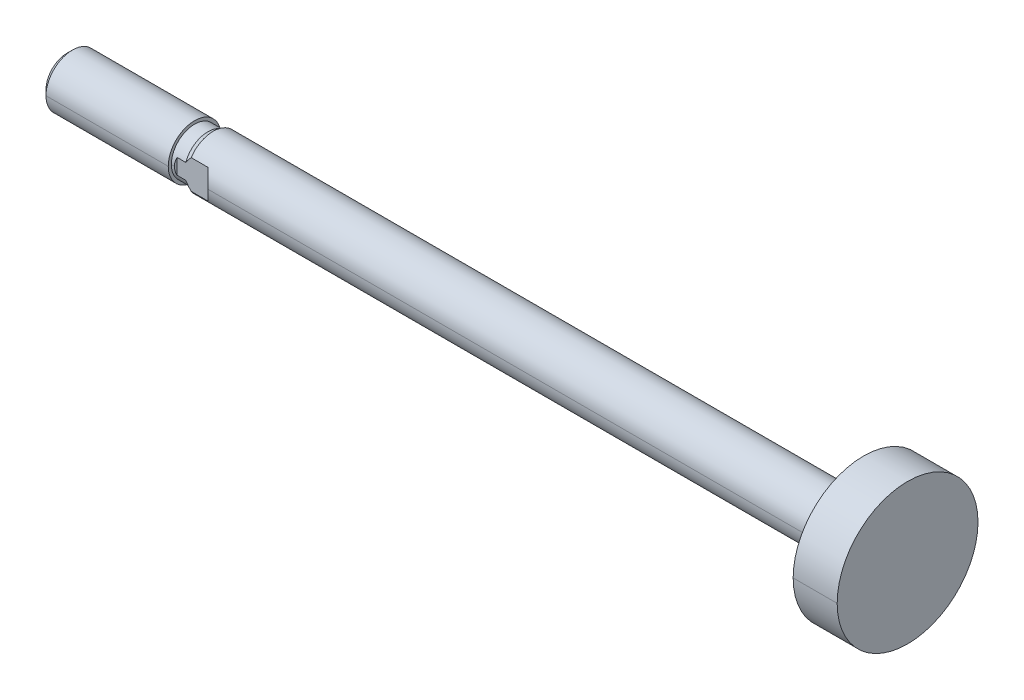
ISO-10303-21;
HEADER;
FILE_DESCRIPTION(('STEP AP214'),'2;1');
FILE_NAME('part.step','',(''),(''),'','','');
FILE_SCHEMA(('AUTOMOTIVE_DESIGN { 1 0 10303 214 1 1 1 1 }'));
ENDSEC;
DATA;
#1=APPLICATION_CONTEXT('core data for automotive mechanical design processes');
#2=APPLICATION_PROTOCOL_DEFINITION('international standard','automotive_design',2000,#1);
#3=PRODUCT_CONTEXT('',#1,'mechanical');
#4=PRODUCT('Part','Part','',(#3));
#5=PRODUCT_RELATED_PRODUCT_CATEGORY('part','',(#4));
#6=PRODUCT_DEFINITION_FORMATION('','',#4);
#7=PRODUCT_DEFINITION_CONTEXT('part definition',#1,'design');
#8=PRODUCT_DEFINITION('design','',#6,#7);
#9=PRODUCT_DEFINITION_SHAPE('','',#8);
#10=(LENGTH_UNIT() NAMED_UNIT(*) SI_UNIT(.MILLI.,.METRE.));
#11=(NAMED_UNIT(*) PLANE_ANGLE_UNIT() SI_UNIT($,.RADIAN.));
#12=(NAMED_UNIT(*) SI_UNIT($,.STERADIAN.) SOLID_ANGLE_UNIT());
#13=UNCERTAINTY_MEASURE_WITH_UNIT(LENGTH_MEASURE(1.E-05),#10,'distance_accuracy_value','');
#14=(GEOMETRIC_REPRESENTATION_CONTEXT(3) GLOBAL_UNCERTAINTY_ASSIGNED_CONTEXT((#13)) GLOBAL_UNIT_ASSIGNED_CONTEXT((#10,
#11,#12)) REPRESENTATION_CONTEXT('',''));
#15=CARTESIAN_POINT('',(0.,0.,0.));
#16=DIRECTION('',(0.,0.,1.));
#17=DIRECTION('',(1.,0.,0.));
#18=AXIS2_PLACEMENT_3D('',#15,#16,#17);
#19=CARTESIAN_POINT('',(-23.,5.,-2.5));
#20=DIRECTION('',(0.,0.,-1.));
#21=DIRECTION('',(-1.,0.,0.));
#22=AXIS2_PLACEMENT_3D('',#19,#20,#21);
#23=PLANE('',#22);
#24=DIRECTION('',(1.,0.,0.));
#25=VECTOR('',#24,1.);
#26=CARTESIAN_POINT('',(57.5,0.878919791562347,-2.5));
#27=LINE('',#26,#25);
#28=CARTESIAN_POINT('',(-23.,0.878919791562347,-2.5));
#29=VERTEX_POINT('',#28);
#30=CARTESIAN_POINT('',(-22.,0.878919791562347,-2.5));
#31=VERTEX_POINT('',#30);
#32=EDGE_CURVE('E11',#29,#31,#27,.T.);
#33=ORIENTED_EDGE('',*,*,#32,.T.);
#34=CARTESIAN_POINT('',(-22.,0.878919791562347,-2.5));
#35=CARTESIAN_POINT('',(-21.9178841787554,1.02186277530427,-2.5));
#36=CARTESIAN_POINT('',(-21.8217652070485,1.15833255557154,-2.5));
#37=CARTESIAN_POINT('',(-21.6163220023517,1.4173432724592,-2.5));
#38=CARTESIAN_POINT('',(-21.5070842409828,1.53997229104446,-2.5));
#39=CARTESIAN_POINT('',(-21.393782217351,1.6583123951777,-2.5));
#40=B_SPLINE_CURVE_WITH_KNOTS('',3,(#34,#35,#36,#37,#38,#39),.UNSPECIFIED.,.F.,.F.,(4,2,4),
(0.00740463080159959,0.00789979861207705,0.0083949664225545),.UNSPECIFIED.);
#41=CARTESIAN_POINT('',(-21.393782217351,1.6583123951777,-2.5));
#42=VERTEX_POINT('',#41);
#43=EDGE_CURVE('E26',#31,#42,#40,.T.);
#44=ORIENTED_EDGE('',*,*,#43,.T.);
#45=DIRECTION('',(1.,0.,0.));
#46=VECTOR('',#45,1.);
#47=CARTESIAN_POINT('',(57.5,1.6583123951777,-2.5));
#48=LINE('',#47,#46);
#49=CARTESIAN_POINT('',(-19.5,1.6583123951777,-2.5));
#50=VERTEX_POINT('',#49);
#51=EDGE_CURVE('E458',#42,#50,#48,.T.);
#52=ORIENTED_EDGE('',*,*,#51,.T.);
#53=DIRECTION('',(0.,-1.,0.));
#54=VECTOR('',#53,1.);
#55=CARTESIAN_POINT('',(-19.5,5.,-2.5));
#56=LINE('',#55,#54);
#57=CARTESIAN_POINT('',(-19.5,-1.6583123951777,-2.5));
#58=VERTEX_POINT('',#57);
#59=EDGE_CURVE('E454',#50,#58,#56,.T.);
#60=ORIENTED_EDGE('',*,*,#59,.T.);
#61=DIRECTION('',(1.,0.,0.));
#62=VECTOR('',#61,1.);
#63=CARTESIAN_POINT('',(57.5,-1.6583123951777,-2.5));
#64=LINE('',#63,#62);
#65=CARTESIAN_POINT('',(-21.393782217351,-1.6583123951777,-2.5));
#66=VERTEX_POINT('',#65);
#67=EDGE_CURVE('E451',#66,#58,#64,.T.);
#68=ORIENTED_EDGE('',*,*,#67,.F.);
#69=CARTESIAN_POINT('',(-21.393782217351,-1.6583123951777,-2.5));
#70=CARTESIAN_POINT('',(-21.6210529462071,-1.42093586069796,-2.5));
#71=CARTESIAN_POINT('',(-21.8355995167455,-1.1650996683371,-2.5));
#72=CARTESIAN_POINT('',(-22.0000000000001,-0.87891979156238,-2.5));
#73=B_SPLINE_CURVE_WITH_KNOTS('',3,(#69,#70,#71,#72),.UNSPECIFIED.,.F.,.F.,(4,4),
(0.00456670058366783,0.00555367988174156),.UNSPECIFIED.);
#74=CARTESIAN_POINT('',(-22.,-0.878919791562347,-2.5));
#75=VERTEX_POINT('',#74);
#76=EDGE_CURVE('E439',#66,#75,#73,.T.);
#77=ORIENTED_EDGE('',*,*,#76,.T.);
#78=DIRECTION('',(1.,0.,0.));
#79=VECTOR('',#78,1.);
#80=CARTESIAN_POINT('',(57.5,-0.878919791562347,-2.5));
#81=LINE('',#80,#79);
#82=CARTESIAN_POINT('',(-23.,-0.878919791562347,-2.5));
#83=VERTEX_POINT('',#82);
#84=EDGE_CURVE('E434',#83,#75,#81,.T.);
#85=ORIENTED_EDGE('',*,*,#84,.F.);
#86=DIRECTION('',(0.,-1.,0.));
#87=VECTOR('',#86,1.);
#88=CARTESIAN_POINT('',(-23.,5.,-2.5));
#89=LINE('',#88,#87);
#90=EDGE_CURVE('E429',#29,#83,#89,.T.);
#91=ORIENTED_EDGE('',*,*,#90,.F.);
#92=EDGE_LOOP('',(#33,#44,#52,#60,#68,#77,#85,#91));
#93=FACE_BOUND('',#92,.T.);
#94=ADVANCED_FACE('F17',(#93),#23,.T.);
#95=CARTESIAN_POINT('',(-23.3,5.,-2.8));
#96=DIRECTION('',(0.707106781186546,0.,-0.707106781186549));
#97=DIRECTION('',(-0.707106781186549,0.,-0.707106781186546));
#98=AXIS2_PLACEMENT_3D('',#95,#96,#97);
#99=PLANE('',#98);
#100=CARTESIAN_POINT('',(-20.5,0.,0.));
#101=DIRECTION('',(0.707106781186546,0.,-0.707106781186549));
#102=DIRECTION('',(0.707106781186549,0.,0.707106781186546));
#103=AXIS2_PLACEMENT_3D('',#100,#101,#102);
#104=ELLIPSE('',#103,3.7476659403,2.65);
#105=CARTESIAN_POINT('',(-23.150000000008,0.,-2.65));
#106=VERTEX_POINT('',#105);
#107=EDGE_CURVE('E425',#83,#106,#104,.T.);
#108=ORIENTED_EDGE('',*,*,#107,.T.);
#109=CARTESIAN_POINT('',(-20.5,0.,0.));
#110=DIRECTION('',(0.707106781186546,0.,-0.707106781186549));
#111=DIRECTION('',(0.707106781186549,0.,0.707106781186546));
#112=AXIS2_PLACEMENT_3D('',#109,#110,#111);
#113=ELLIPSE('',#112,3.7476659403,2.65);
#114=EDGE_CURVE('E420',#106,#29,#113,.T.);
#115=ORIENTED_EDGE('',*,*,#114,.T.);
#116=ORIENTED_EDGE('',*,*,#90,.T.);
#117=EDGE_LOOP('',(#108,#115,#116));
#118=FACE_BOUND('',#117,.T.);
#119=ADVANCED_FACE('F499',(#118),#99,.T.);
#120=CARTESIAN_POINT('',(57.5,0.,0.));
#121=DIRECTION('',(-1.,0.,0.));
#122=DIRECTION('',(0.,-1.,0.));
#123=AXIS2_PLACEMENT_3D('',#120,#121,#122);
#124=CYLINDRICAL_SURFACE('',#123,2.65);
#125=CARTESIAN_POINT('',(-20.5,0.,0.));
#126=DIRECTION('',(0.707106781186546,0.,0.707106781186549));
#127=DIRECTION('',(0.707106781186549,0.,-0.707106781186546));
#128=AXIS2_PLACEMENT_3D('',#125,#126,#127);
#129=ELLIPSE('',#128,3.7476659403,2.65);
#130=CARTESIAN_POINT('',(-23.,0.878919791562344,2.5));
#131=VERTEX_POINT('',#130);
#132=CARTESIAN_POINT('',(-23.150000000008,0.,2.65));
#133=VERTEX_POINT('',#132);
#134=EDGE_CURVE('E415',#131,#133,#129,.T.);
#135=ORIENTED_EDGE('',*,*,#134,.F.);
#136=DIRECTION('',(1.,0.,0.));
#137=VECTOR('',#136,1.);
#138=CARTESIAN_POINT('',(57.5,0.878919791562347,2.5));
#139=LINE('',#138,#137);
#140=CARTESIAN_POINT('',(-22.,0.878919791562347,2.5));
#141=VERTEX_POINT('',#140);
#142=EDGE_CURVE('E411',#131,#141,#139,.T.);
#143=ORIENTED_EDGE('',*,*,#142,.T.);
#144=CARTESIAN_POINT('',(-22.,0.,0.));
#145=DIRECTION('',(1.,0.,0.));
#146=DIRECTION('',(0.,0.,-1.));
#147=AXIS2_PLACEMENT_3D('',#144,#145,#146);
#148=CIRCLE('',#147,2.65);
#149=EDGE_CURVE('E407',#31,#141,#148,.T.);
#150=ORIENTED_EDGE('',*,*,#149,.F.);
#151=ORIENTED_EDGE('',*,*,#32,.F.);
#152=ORIENTED_EDGE('',*,*,#114,.F.);
#153=DIRECTION('',(-1.,0.,0.));
#154=VECTOR('',#153,1.);
#155=CARTESIAN_POINT('',(-23.150000000008,0.,-2.65));
#156=LINE('',#155,#154);
#157=CARTESIAN_POINT('',(-23.5,0.,-2.65));
#158=VERTEX_POINT('',#157);
#159=EDGE_CURVE('E403',#106,#158,#156,.T.);
#160=ORIENTED_EDGE('',*,*,#159,.T.);
#161=CARTESIAN_POINT('',(-23.5,0.,0.));
#162=DIRECTION('',(1.,0.,0.));
#163=DIRECTION('',(0.,0.,-1.));
#164=AXIS2_PLACEMENT_3D('',#161,#162,#163);
#165=CIRCLE('',#164,2.65);
#166=CARTESIAN_POINT('',(-23.5,0.,2.65));
#167=VERTEX_POINT('',#166);
#168=EDGE_CURVE('E399',#158,#167,#165,.T.);
#169=ORIENTED_EDGE('',*,*,#168,.T.);
#170=DIRECTION('',(-1.,0.,0.));
#171=VECTOR('',#170,1.);
#172=CARTESIAN_POINT('',(-23.150000000008,0.,2.65));
#173=LINE('',#172,#171);
#174=EDGE_CURVE('E394',#133,#167,#173,.T.);
#175=ORIENTED_EDGE('',*,*,#174,.F.);
#176=EDGE_LOOP('',(#135,#143,#150,#151,#152,#160,#169,#175));
#177=FACE_BOUND('',#176,.T.);
#178=ADVANCED_FACE('F496',(#177),#124,.T.);
#179=CARTESIAN_POINT('',(57.5,0.,0.));
#180=DIRECTION('',(-1.,0.,0.));
#181=DIRECTION('',(0.,1.,0.));
#182=AXIS2_PLACEMENT_3D('',#179,#180,#181);
#183=CYLINDRICAL_SURFACE('',#182,2.65);
#184=CARTESIAN_POINT('',(-23.5,0.,0.));
#185=DIRECTION('',(1.,0.,0.));
#186=DIRECTION('',(0.,0.,-1.));
#187=AXIS2_PLACEMENT_3D('',#184,#185,#186);
#188=CIRCLE('',#187,2.65);
#189=EDGE_CURVE('E389',#167,#158,#188,.T.);
#190=ORIENTED_EDGE('',*,*,#189,.T.);
#191=ORIENTED_EDGE('',*,*,#159,.F.);
#192=ORIENTED_EDGE('',*,*,#107,.F.);
#193=ORIENTED_EDGE('',*,*,#84,.T.);
#194=CARTESIAN_POINT('',(-22.,0.,0.));
#195=DIRECTION('',(1.,0.,0.));
#196=DIRECTION('',(0.,0.,-1.));
#197=AXIS2_PLACEMENT_3D('',#194,#195,#196);
#198=CIRCLE('',#197,2.65);
#199=CARTESIAN_POINT('',(-22.,-0.878919791562347,2.5));
#200=VERTEX_POINT('',#199);
#201=EDGE_CURVE('E385',#200,#75,#198,.T.);
#202=ORIENTED_EDGE('',*,*,#201,.F.);
#203=DIRECTION('',(1.,0.,0.));
#204=VECTOR('',#203,1.);
#205=CARTESIAN_POINT('',(57.5,-0.878919791562347,2.5));
#206=LINE('',#205,#204);
#207=CARTESIAN_POINT('',(-23.,-0.878919791562343,2.5));
#208=VERTEX_POINT('',#207);
#209=EDGE_CURVE('E381',#208,#200,#206,.T.);
#210=ORIENTED_EDGE('',*,*,#209,.F.);
#211=CARTESIAN_POINT('',(-20.5,0.,0.));
#212=DIRECTION('',(0.707106781186546,0.,0.707106781186549));
#213=DIRECTION('',(0.707106781186549,0.,-0.707106781186546));
#214=AXIS2_PLACEMENT_3D('',#211,#212,#213);
#215=ELLIPSE('',#214,3.7476659403,2.65);
#216=EDGE_CURVE('E376',#133,#208,#215,.T.);
#217=ORIENTED_EDGE('',*,*,#216,.F.);
#218=ORIENTED_EDGE('',*,*,#174,.T.);
#219=EDGE_LOOP('',(#190,#191,#192,#193,#202,#210,#217,#218));
#220=FACE_BOUND('',#219,.T.);
#221=ADVANCED_FACE('F483',(#220),#183,.T.);
#222=CARTESIAN_POINT('',(-23.,5.,2.5));
#223=DIRECTION('',(0.707106781186546,0.,0.707106781186549));
#224=DIRECTION('',(0.707106781186549,0.,-0.707106781186546));
#225=AXIS2_PLACEMENT_3D('',#222,#223,#224);
#226=PLANE('',#225);
#227=ORIENTED_EDGE('',*,*,#134,.T.);
#228=ORIENTED_EDGE('',*,*,#216,.T.);
#229=DIRECTION('',(0.,-1.,0.));
#230=VECTOR('',#229,1.);
#231=CARTESIAN_POINT('',(-23.,5.,2.5));
#232=LINE('',#231,#230);
#233=EDGE_CURVE('E373',#131,#208,#232,.T.);
#234=ORIENTED_EDGE('',*,*,#233,.F.);
#235=EDGE_LOOP('',(#227,#228,#234));
#236=FACE_BOUND('',#235,.T.);
#237=ADVANCED_FACE('F488',(#236),#226,.T.);
#238=CARTESIAN_POINT('',(-19.5,5.,2.5));
#239=DIRECTION('',(0.,0.,1.));
#240=DIRECTION('',(1.,0.,0.));
#241=AXIS2_PLACEMENT_3D('',#238,#239,#240);
#242=PLANE('',#241);
#243=ORIENTED_EDGE('',*,*,#209,.T.);
#244=CARTESIAN_POINT('',(-22.,-0.878919791562347,2.5));
#245=CARTESIAN_POINT('',(-21.9178841787554,-1.02186277530427,2.5));
#246=CARTESIAN_POINT('',(-21.8217652070485,-1.15833255557154,2.5));
#247=CARTESIAN_POINT('',(-21.6163220023517,-1.4173432724592,2.5));
#248=CARTESIAN_POINT('',(-21.5070842409828,-1.53997229104446,2.5));
#249=CARTESIAN_POINT('',(-21.393782217351,-1.6583123951777,2.5));
#250=B_SPLINE_CURVE_WITH_KNOTS('',3,(#244,#245,#246,#247,#248,#249),.UNSPECIFIED.,.F.,.F.,(4,2,
4),(0.00740463080159959,0.00789979861207705,0.0083949664225545),.UNSPECIFIED.);
#251=CARTESIAN_POINT('',(-21.393782217351,-1.6583123951777,2.5));
#252=VERTEX_POINT('',#251);
#253=EDGE_CURVE('E223',#200,#252,#250,.T.);
#254=ORIENTED_EDGE('',*,*,#253,.T.);
#255=DIRECTION('',(1.,0.,0.));
#256=VECTOR('',#255,1.);
#257=CARTESIAN_POINT('',(57.5,-1.6583123951777,2.5));
#258=LINE('',#257,#256);
#259=CARTESIAN_POINT('',(-19.5,-1.6583123951777,2.5));
#260=VERTEX_POINT('',#259);
#261=EDGE_CURVE('E356',#252,#260,#258,.T.);
#262=ORIENTED_EDGE('',*,*,#261,.T.);
#263=DIRECTION('',(0.,-1.,0.));
#264=VECTOR('',#263,1.);
#265=CARTESIAN_POINT('',(-19.5,5.,2.5));
#266=LINE('',#265,#264);
#267=CARTESIAN_POINT('',(-19.5,1.6583123951777,2.5));
#268=VERTEX_POINT('',#267);
#269=EDGE_CURVE('E351',#268,#260,#266,.T.);
#270=ORIENTED_EDGE('',*,*,#269,.F.);
#271=DIRECTION('',(1.,0.,0.));
#272=VECTOR('',#271,1.);
#273=CARTESIAN_POINT('',(57.5,1.6583123951777,2.5));
#274=LINE('',#273,#272);
#275=CARTESIAN_POINT('',(-21.393782217351,1.6583123951777,2.5));
#276=VERTEX_POINT('',#275);
#277=EDGE_CURVE('E348',#276,#268,#274,.T.);
#278=ORIENTED_EDGE('',*,*,#277,.F.);
#279=CARTESIAN_POINT('',(-21.393782217351,1.6583123951777,2.5));
#280=CARTESIAN_POINT('',(-21.6210529462071,1.42093586069796,2.5));
#281=CARTESIAN_POINT('',(-21.8355995167455,1.1650996683371,2.5));
#282=CARTESIAN_POINT('',(-22.0000000000001,0.87891979156238,2.5));
#283=B_SPLINE_CURVE_WITH_KNOTS('',3,(#279,#280,#281,#282),.UNSPECIFIED.,.F.,.F.,(4,4),
(0.00456670058366783,0.00555367988174156),.UNSPECIFIED.);
#284=EDGE_CURVE('E300',#276,#141,#283,.T.);
#285=ORIENTED_EDGE('',*,*,#284,.T.);
#286=ORIENTED_EDGE('',*,*,#142,.F.);
#287=ORIENTED_EDGE('',*,*,#233,.T.);
#288=EDGE_LOOP('',(#243,#254,#262,#270,#278,#285,#286,#287));
#289=FACE_BOUND('',#288,.T.);
#290=ADVANCED_FACE('F320',(#289),#242,.T.);
#291=CARTESIAN_POINT('',(-22.,0.,0.));
#292=DIRECTION('',(1.,0.,0.));
#293=DIRECTION('',(0.,-1.,0.));
#294=AXIS2_PLACEMENT_3D('',#291,#292,#293);
#295=CONICAL_SURFACE('',#294,2.65,0.5235987756);
#296=ORIENTED_EDGE('',*,*,#43,.F.);
#297=ORIENTED_EDGE('',*,*,#149,.T.);
#298=ORIENTED_EDGE('',*,*,#284,.F.);
#299=CARTESIAN_POINT('',(-21.393782217351,0.,0.));
#300=DIRECTION('',(1.,0.,0.));
#301=DIRECTION('',(0.,0.,-1.));
#302=AXIS2_PLACEMENT_3D('',#299,#300,#301);
#303=CIRCLE('',#302,3.);
#304=EDGE_CURVE('E295',#42,#276,#303,.T.);
#305=ORIENTED_EDGE('',*,*,#304,.F.);
#306=EDGE_LOOP('',(#296,#297,#298,#305));
#307=FACE_BOUND('',#306,.T.);
#308=ADVANCED_FACE('F309',(#307),#295,.T.);
#309=CARTESIAN_POINT('',(57.5,0.,0.));
#310=DIRECTION('',(-1.,0.,0.));
#311=DIRECTION('',(0.,-1.,0.));
#312=AXIS2_PLACEMENT_3D('',#309,#310,#311);
#313=CYLINDRICAL_SURFACE('',#312,3.);
#314=CARTESIAN_POINT('',(52.5,0.,0.));
#315=DIRECTION('',(1.,0.,0.));
#316=DIRECTION('',(0.,0.,-1.));
#317=AXIS2_PLACEMENT_3D('',#314,#315,#316);
#318=CIRCLE('',#317,3.);
#319=CARTESIAN_POINT('',(52.5,0.,-3.));
#320=VERTEX_POINT('',#319);
#321=CARTESIAN_POINT('',(52.5,0.,3.));
#322=VERTEX_POINT('',#321);
#323=EDGE_CURVE('E290',#320,#322,#318,.T.);
#324=ORIENTED_EDGE('',*,*,#323,.F.);
#325=DIRECTION('',(-1.,0.,0.));
#326=VECTOR('',#325,1.);
#327=CARTESIAN_POINT('',(52.5,0.,-3.));
#328=LINE('',#327,#326);
#329=CARTESIAN_POINT('',(-19.0000000000136,0.,-3.));
#330=VERTEX_POINT('',#329);
#331=EDGE_CURVE('E286',#320,#330,#328,.T.);
#332=ORIENTED_EDGE('',*,*,#331,.T.);
#333=CARTESIAN_POINT('',(-22.,0.,0.));
#334=DIRECTION('',(-0.707106781186548,0.,-0.707106781186548));
#335=DIRECTION('',(0.707106781186548,0.,-0.707106781186548));
#336=AXIS2_PLACEMENT_3D('',#333,#334,#335);
#337=ELLIPSE('',#336,4.2426406871,3.);
#338=EDGE_CURVE('E281',#50,#330,#337,.T.);
#339=ORIENTED_EDGE('',*,*,#338,.F.);
#340=ORIENTED_EDGE('',*,*,#51,.F.);
#341=ORIENTED_EDGE('',*,*,#304,.T.);
#342=ORIENTED_EDGE('',*,*,#277,.T.);
#343=CARTESIAN_POINT('',(-22.,0.,0.));
#344=DIRECTION('',(-0.707106781186548,0.,0.707106781186548));
#345=DIRECTION('',(0.707106781186548,0.,0.707106781186548));
#346=AXIS2_PLACEMENT_3D('',#343,#344,#345);
#347=ELLIPSE('',#346,4.2426406871,3.);
#348=CARTESIAN_POINT('',(-19.0000000000136,0.,3.));
#349=VERTEX_POINT('',#348);
#350=EDGE_CURVE('E276',#349,#268,#347,.T.);
#351=ORIENTED_EDGE('',*,*,#350,.F.);
#352=DIRECTION('',(-1.,0.,0.));
#353=VECTOR('',#352,1.);
#354=CARTESIAN_POINT('',(52.5,0.,3.));
#355=LINE('',#354,#353);
#356=EDGE_CURVE('E271',#322,#349,#355,.T.);
#357=ORIENTED_EDGE('',*,*,#356,.F.);
#358=EDGE_LOOP('',(#324,#332,#339,#340,#341,#342,#351,#357));
#359=FACE_BOUND('',#358,.T.);
#360=ADVANCED_FACE('F319',(#359),#313,.T.);
#361=CARTESIAN_POINT('',(57.5,0.,0.));
#362=DIRECTION('',(-1.,0.,0.));
#363=DIRECTION('',(0.,1.,0.));
#364=AXIS2_PLACEMENT_3D('',#361,#362,#363);
#365=CYLINDRICAL_SURFACE('',#364,3.);
#366=CARTESIAN_POINT('',(-22.,0.,0.));
#367=DIRECTION('',(-0.707106781186548,0.,0.707106781186548));
#368=DIRECTION('',(0.707106781186548,0.,0.707106781186548));
#369=AXIS2_PLACEMENT_3D('',#366,#367,#368);
#370=ELLIPSE('',#369,4.2426406871,3.);
#371=EDGE_CURVE('E266',#260,#349,#370,.T.);
#372=ORIENTED_EDGE('',*,*,#371,.F.);
#373=ORIENTED_EDGE('',*,*,#261,.F.);
#374=CARTESIAN_POINT('',(-21.393782217351,0.,0.));
#375=DIRECTION('',(1.,0.,0.));
#376=DIRECTION('',(0.,0.,-1.));
#377=AXIS2_PLACEMENT_3D('',#374,#375,#376);
#378=CIRCLE('',#377,3.);
#379=EDGE_CURVE('E261',#252,#66,#378,.T.);
#380=ORIENTED_EDGE('',*,*,#379,.T.);
#381=ORIENTED_EDGE('',*,*,#67,.T.);
#382=CARTESIAN_POINT('',(-22.,0.,0.));
#383=DIRECTION('',(-0.707106781186548,0.,-0.707106781186548));
#384=DIRECTION('',(0.707106781186548,0.,-0.707106781186548));
#385=AXIS2_PLACEMENT_3D('',#382,#383,#384);
#386=ELLIPSE('',#385,4.2426406871,3.);
#387=EDGE_CURVE('E256',#330,#58,#386,.T.);
#388=ORIENTED_EDGE('',*,*,#387,.F.);
#389=ORIENTED_EDGE('',*,*,#331,.F.);
#390=CARTESIAN_POINT('',(52.5,0.,0.));
#391=DIRECTION('',(1.,0.,0.));
#392=DIRECTION('',(0.,0.,-1.));
#393=AXIS2_PLACEMENT_3D('',#390,#391,#392);
#394=CIRCLE('',#393,3.);
#395=EDGE_CURVE('E251',#322,#320,#394,.T.);
#396=ORIENTED_EDGE('',*,*,#395,.F.);
#397=ORIENTED_EDGE('',*,*,#356,.T.);
#398=EDGE_LOOP('',(#372,#373,#380,#381,#388,#389,#396,#397));
#399=FACE_BOUND('',#398,.T.);
#400=ADVANCED_FACE('F480',(#399),#365,.T.);
#401=CARTESIAN_POINT('',(52.5,3.,0.));
#402=DIRECTION('',(1.,0.,0.));
#403=DIRECTION('',(0.,0.,-1.));
#404=AXIS2_PLACEMENT_3D('',#401,#402,#403);
#405=PLANE('',#404);
#406=CARTESIAN_POINT('',(52.5,0.,0.));
#407=DIRECTION('',(1.,0.,0.));
#408=DIRECTION('',(0.,0.,-1.));
#409=AXIS2_PLACEMENT_3D('',#406,#407,#408);
#410=CIRCLE('',#409,8.);
#411=CARTESIAN_POINT('',(52.5,0.,-8.));
#412=VERTEX_POINT('',#411);
#413=CARTESIAN_POINT('',(52.5,0.,8.));
#414=VERTEX_POINT('',#413);
#415=EDGE_CURVE('E246',#412,#414,#410,.T.);
#416=ORIENTED_EDGE('',*,*,#415,.F.);
#417=CARTESIAN_POINT('',(52.5,0.,0.));
#418=DIRECTION('',(1.,0.,0.));
#419=DIRECTION('',(0.,0.,-1.));
#420=AXIS2_PLACEMENT_3D('',#417,#418,#419);
#421=CIRCLE('',#420,8.);
#422=EDGE_CURVE('E241',#414,#412,#421,.T.);
#423=ORIENTED_EDGE('',*,*,#422,.F.);
#424=EDGE_LOOP('',(#416,#423));
#425=FACE_BOUND('',#424,.T.);
#426=ORIENTED_EDGE('',*,*,#323,.T.);
#427=ORIENTED_EDGE('',*,*,#395,.T.);
#428=EDGE_LOOP('',(#426,#427));
#429=FACE_BOUND('',#428,.T.);
#430=ADVANCED_FACE('F502',(#425,#429),#405,.F.);
#431=CARTESIAN_POINT('',(57.5,0.,0.));
#432=DIRECTION('',(-1.,0.,0.));
#433=DIRECTION('',(0.,1.,0.));
#434=AXIS2_PLACEMENT_3D('',#431,#432,#433);
#435=CYLINDRICAL_SURFACE('',#434,8.);
#436=ORIENTED_EDGE('',*,*,#422,.T.);
#437=DIRECTION('',(-1.,0.,0.));
#438=VECTOR('',#437,1.);
#439=CARTESIAN_POINT('',(57.5,0.,-8.));
#440=LINE('',#439,#438);
#441=CARTESIAN_POINT('',(57.5,0.,-8.));
#442=VERTEX_POINT('',#441);
#443=EDGE_CURVE('E236',#442,#412,#440,.T.);
#444=ORIENTED_EDGE('',*,*,#443,.F.);
#445=CARTESIAN_POINT('',(57.5,0.,0.));
#446=DIRECTION('',(1.,0.,0.));
#447=DIRECTION('',(0.,0.,-1.));
#448=AXIS2_PLACEMENT_3D('',#445,#446,#447);
#449=CIRCLE('',#448,8.);
#450=CARTESIAN_POINT('',(57.5,0.,8.));
#451=VERTEX_POINT('',#450);
#452=EDGE_CURVE('E231',#451,#442,#449,.T.);
#453=ORIENTED_EDGE('',*,*,#452,.F.);
#454=DIRECTION('',(-1.,0.,0.));
#455=VECTOR('',#454,1.);
#456=CARTESIAN_POINT('',(57.5,0.,8.));
#457=LINE('',#456,#455);
#458=EDGE_CURVE('E226',#451,#414,#457,.T.);
#459=ORIENTED_EDGE('',*,*,#458,.T.);
#460=EDGE_LOOP('',(#436,#444,#453,#459));
#461=FACE_BOUND('',#460,.T.);
#462=ADVANCED_FACE('F504',(#461),#435,.T.);
#463=CARTESIAN_POINT('',(57.5,0.,0.));
#464=DIRECTION('',(-1.,0.,0.));
#465=DIRECTION('',(0.,-1.,0.));
#466=AXIS2_PLACEMENT_3D('',#463,#464,#465);
#467=CYLINDRICAL_SURFACE('',#466,8.);
#468=CARTESIAN_POINT('',(57.5,0.,0.));
#469=DIRECTION('',(1.,0.,0.));
#470=DIRECTION('',(0.,0.,-1.));
#471=AXIS2_PLACEMENT_3D('',#468,#469,#470);
#472=CIRCLE('',#471,8.);
#473=EDGE_CURVE('E186',#442,#451,#472,.T.);
#474=ORIENTED_EDGE('',*,*,#473,.F.);
#475=ORIENTED_EDGE('',*,*,#443,.T.);
#476=ORIENTED_EDGE('',*,*,#415,.T.);
#477=ORIENTED_EDGE('',*,*,#458,.F.);
#478=EDGE_LOOP('',(#474,#475,#476,#477));
#479=FACE_BOUND('',#478,.T.);
#480=ADVANCED_FACE('F512',(#479),#467,.T.);
#481=CARTESIAN_POINT('',(57.5,8.,0.));
#482=DIRECTION('',(-1.,0.,0.));
#483=DIRECTION('',(0.,0.,1.));
#484=AXIS2_PLACEMENT_3D('',#481,#482,#483);
#485=PLANE('',#484);
#486=ORIENTED_EDGE('',*,*,#473,.T.);
#487=ORIENTED_EDGE('',*,*,#452,.T.);
#488=EDGE_LOOP('',(#486,#487));
#489=FACE_BOUND('',#488,.T.);
#490=ADVANCED_FACE('F567',(#489),#485,.F.);
#491=CARTESIAN_POINT('',(-19.5,5.,-2.5));
#492=DIRECTION('',(-0.707106781186548,0.,-0.707106781186548));
#493=DIRECTION('',(-0.707106781186548,0.,0.707106781186548));
#494=AXIS2_PLACEMENT_3D('',#491,#492,#493);
#495=PLANE('',#494);
#496=ORIENTED_EDGE('',*,*,#338,.T.);
#497=ORIENTED_EDGE('',*,*,#387,.T.);
#498=ORIENTED_EDGE('',*,*,#59,.F.);
#499=EDGE_LOOP('',(#496,#497,#498));
#500=FACE_BOUND('',#499,.T.);
#501=ADVANCED_FACE('F206',(#500),#495,.T.);
#502=CARTESIAN_POINT('',(-22.,0.,0.));
#503=DIRECTION('',(1.,0.,0.));
#504=DIRECTION('',(0.,1.,0.));
#505=AXIS2_PLACEMENT_3D('',#502,#503,#504);
#506=CONICAL_SURFACE('',#505,2.65,0.5235987756);
#507=ORIENTED_EDGE('',*,*,#253,.F.);
#508=ORIENTED_EDGE('',*,*,#201,.T.);
#509=ORIENTED_EDGE('',*,*,#76,.F.);
#510=ORIENTED_EDGE('',*,*,#379,.F.);
#511=EDGE_LOOP('',(#507,#508,#509,#510));
#512=FACE_BOUND('',#511,.T.);
#513=ADVANCED_FACE('F195',(#512),#506,.T.);
#514=CARTESIAN_POINT('',(-14.5,5.,7.5));
#515=DIRECTION('',(-0.707106781186548,0.,0.707106781186548));
#516=DIRECTION('',(0.707106781186548,0.,0.707106781186548));
#517=AXIS2_PLACEMENT_3D('',#514,#515,#516);
#518=PLANE('',#517);
#519=ORIENTED_EDGE('',*,*,#371,.T.);
#520=ORIENTED_EDGE('',*,*,#350,.T.);
#521=ORIENTED_EDGE('',*,*,#269,.T.);
#522=EDGE_LOOP('',(#519,#520,#521));
#523=FACE_BOUND('',#522,.T.);
#524=ADVANCED_FACE('F205',(#523),#518,.T.);
#525=CARTESIAN_POINT('',(-23.5,3.,0.));
#526=DIRECTION('',(-1.,0.,0.));
#527=DIRECTION('',(0.,0.,1.));
#528=AXIS2_PLACEMENT_3D('',#525,#526,#527);
#529=PLANE('',#528);
#530=ORIENTED_EDGE('',*,*,#168,.F.);
#531=ORIENTED_EDGE('',*,*,#189,.F.);
#532=EDGE_LOOP('',(#530,#531));
#533=FACE_BOUND('',#532,.T.);
#534=CARTESIAN_POINT('',(-23.5,0.,0.));
#535=DIRECTION('',(1.,0.,0.));
#536=DIRECTION('',(0.,0.,-1.));
#537=AXIS2_PLACEMENT_3D('',#534,#535,#536);
#538=CIRCLE('',#537,3.);
#539=CARTESIAN_POINT('',(-23.5,0.,-3.));
#540=VERTEX_POINT('',#539);
#541=CARTESIAN_POINT('',(-23.5,0.,3.));
#542=VERTEX_POINT('',#541);
#543=EDGE_CURVE('E182',#540,#542,#538,.T.);
#544=ORIENTED_EDGE('',*,*,#543,.T.);
#545=CARTESIAN_POINT('',(-23.5,0.,0.));
#546=DIRECTION('',(1.,0.,0.));
#547=DIRECTION('',(0.,0.,-1.));
#548=AXIS2_PLACEMENT_3D('',#545,#546,#547);
#549=CIRCLE('',#548,3.);
#550=EDGE_CURVE('E178',#542,#540,#549,.T.);
#551=ORIENTED_EDGE('',*,*,#550,.T.);
#552=EDGE_LOOP('',(#544,#551));
#553=FACE_BOUND('',#552,.T.);
#554=ADVANCED_FACE('F494',(#533,#553),#529,.F.);
#555=CARTESIAN_POINT('',(57.5,0.,0.));
#556=DIRECTION('',(-1.,0.,0.));
#557=DIRECTION('',(0.,1.,0.));
#558=AXIS2_PLACEMENT_3D('',#555,#556,#557);
#559=CYLINDRICAL_SURFACE('',#558,3.);
#560=CARTESIAN_POINT('',(-37.3865,0.,0.));
#561=DIRECTION('',(1.,0.,0.));
#562=DIRECTION('',(0.,0.,-1.));
#563=AXIS2_PLACEMENT_3D('',#560,#561,#562);
#564=CIRCLE('',#563,3.);
#565=CARTESIAN_POINT('',(-37.3865,0.,3.));
#566=VERTEX_POINT('',#565);
#567=CARTESIAN_POINT('',(-37.3865,0.,-3.));
#568=VERTEX_POINT('',#567);
#569=EDGE_CURVE('E149',#566,#568,#564,.T.);
#570=ORIENTED_EDGE('',*,*,#569,.T.);
#571=DIRECTION('',(-1.,0.,0.));
#572=VECTOR('',#571,1.);
#573=CARTESIAN_POINT('',(-23.5,0.,-3.));
#574=LINE('',#573,#572);
#575=EDGE_CURVE('E170',#540,#568,#574,.T.);
#576=ORIENTED_EDGE('',*,*,#575,.F.);
#577=ORIENTED_EDGE('',*,*,#550,.F.);
#578=DIRECTION('',(-1.,0.,0.));
#579=VECTOR('',#578,1.);
#580=CARTESIAN_POINT('',(-23.5,0.,3.));
#581=LINE('',#580,#579);
#582=EDGE_CURVE('E166',#542,#566,#581,.T.);
#583=ORIENTED_EDGE('',*,*,#582,.T.);
#584=EDGE_LOOP('',(#570,#576,#577,#583));
#585=FACE_BOUND('',#584,.T.);
#586=ADVANCED_FACE('F605',(#585),#559,.T.);
#587=CARTESIAN_POINT('',(57.5,0.,0.));
#588=DIRECTION('',(-1.,0.,0.));
#589=DIRECTION('',(0.,-1.,0.));
#590=AXIS2_PLACEMENT_3D('',#587,#588,#589);
#591=CYLINDRICAL_SURFACE('',#590,3.);
#592=ORIENTED_EDGE('',*,*,#543,.F.);
#593=ORIENTED_EDGE('',*,*,#575,.T.);
#594=CARTESIAN_POINT('',(-37.3865,0.,0.));
#595=DIRECTION('',(1.,0.,0.));
#596=DIRECTION('',(0.,0.,-1.));
#597=AXIS2_PLACEMENT_3D('',#594,#595,#596);
#598=CIRCLE('',#597,3.);
#599=EDGE_CURVE('E161',#568,#566,#598,.T.);
#600=ORIENTED_EDGE('',*,*,#599,.T.);
#601=ORIENTED_EDGE('',*,*,#582,.F.);
#602=EDGE_LOOP('',(#592,#593,#600,#601));
#603=FACE_BOUND('',#602,.T.);
#604=ADVANCED_FACE('F613',(#603),#591,.T.);
#605=CARTESIAN_POINT('',(-38.,0.,0.));
#606=DIRECTION('',(1.,0.,0.));
#607=DIRECTION('',(0.,-1.,0.));
#608=AXIS2_PLACEMENT_3D('',#605,#606,#607);
#609=CONICAL_SURFACE('',#608,2.3865,0.7853981634);
#610=ORIENTED_EDGE('',*,*,#599,.F.);
#611=DIRECTION('',(0.707106781184745,0.,-0.70710678118835));
#612=VECTOR('',#611,1.);
#613=CARTESIAN_POINT('',(-38.,0.,-2.3865));
#614=LINE('',#613,#612);
#615=CARTESIAN_POINT('',(-38.,0.,-2.3865));
#616=VERTEX_POINT('',#615);
#617=EDGE_CURVE('E141',#616,#568,#614,.T.);
#618=ORIENTED_EDGE('',*,*,#617,.F.);
#619=CARTESIAN_POINT('',(-38.,0.,0.));
#620=DIRECTION('',(1.,0.,0.));
#621=DIRECTION('',(0.,0.,-1.));
#622=AXIS2_PLACEMENT_3D('',#619,#620,#621);
#623=CIRCLE('',#622,2.3865);
#624=CARTESIAN_POINT('',(-38.,0.,2.3865));
#625=VERTEX_POINT('',#624);
#626=EDGE_CURVE('E134',#616,#625,#623,.T.);
#627=ORIENTED_EDGE('',*,*,#626,.T.);
#628=DIRECTION('',(0.707106781184745,0.,0.70710678118835));
#629=VECTOR('',#628,1.);
#630=CARTESIAN_POINT('',(-38.,0.,2.3865));
#631=LINE('',#630,#629);
#632=EDGE_CURVE('E138',#625,#566,#631,.T.);
#633=ORIENTED_EDGE('',*,*,#632,.T.);
#634=EDGE_LOOP('',(#610,#618,#627,#633));
#635=FACE_BOUND('',#634,.T.);
#636=ADVANCED_FACE('F137',(#635),#609,.T.);
#637=CARTESIAN_POINT('',(-38.,0.,0.));
#638=DIRECTION('',(1.,0.,0.));
#639=DIRECTION('',(0.,1.,0.));
#640=AXIS2_PLACEMENT_3D('',#637,#638,#639);
#641=CONICAL_SURFACE('',#640,2.3865,0.7853981634);
#642=CARTESIAN_POINT('',(-38.,0.,0.));
#643=DIRECTION('',(1.,0.,0.));
#644=DIRECTION('',(0.,0.,-1.));
#645=AXIS2_PLACEMENT_3D('',#642,#643,#644);
#646=CIRCLE('',#645,2.3865);
#647=EDGE_CURVE('E148',#625,#616,#646,.T.);
#648=ORIENTED_EDGE('',*,*,#647,.T.);
#649=ORIENTED_EDGE('',*,*,#617,.T.);
#650=ORIENTED_EDGE('',*,*,#569,.F.);
#651=ORIENTED_EDGE('',*,*,#632,.F.);
#652=EDGE_LOOP('',(#648,#649,#650,#651));
#653=FACE_BOUND('',#652,.T.);
#654=ADVANCED_FACE('F147',(#653),#641,.T.);
#655=CARTESIAN_POINT('',(-38.,0.,0.));
#656=DIRECTION('',(1.,0.,0.));
#657=DIRECTION('',(0.,0.,-1.));
#658=AXIS2_PLACEMENT_3D('',#655,#656,#657);
#659=PLANE('',#658);
#660=ORIENTED_EDGE('',*,*,#626,.F.);
#661=ORIENTED_EDGE('',*,*,#647,.F.);
#662=EDGE_LOOP('',(#660,#661));
#663=FACE_BOUND('',#662,.T.);
#664=ADVANCED_FACE('F151',(#663),#659,.F.);
#665=CLOSED_SHELL('',(#94,#119,#178,#221,#237,#290,#308,#360,#400,#430,#462,#480,#490,#501,#513,
#524,#554,#586,#604,#636,#654,#664));
#666=MANIFOLD_SOLID_BREP('B1',#665);
#667=ADVANCED_BREP_SHAPE_REPRESENTATION('',(#18,#666),#14);
#668=SHAPE_DEFINITION_REPRESENTATION(#9,#667);
ENDSEC;
END-ISO-10303-21;
